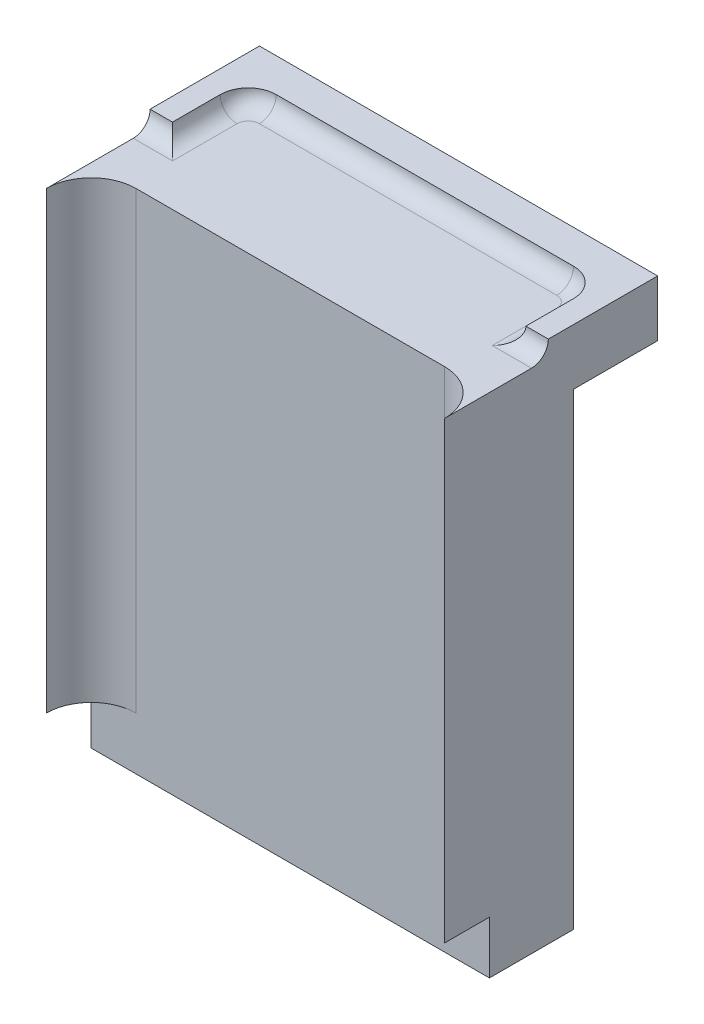
ISO-10303-21;
HEADER;
FILE_DESCRIPTION(('STEP AP214'),'2;1');
FILE_NAME('part.step','',(''),(''),'','','');
FILE_SCHEMA(('AUTOMOTIVE_DESIGN { 1 0 10303 214 1 1 1 1 }'));
ENDSEC;
DATA;
#1=APPLICATION_CONTEXT('core data for automotive mechanical design processes');
#2=APPLICATION_PROTOCOL_DEFINITION('international standard','automotive_design',2000,#1);
#3=PRODUCT_CONTEXT('',#1,'mechanical');
#4=PRODUCT('Part','Part','',(#3));
#5=PRODUCT_RELATED_PRODUCT_CATEGORY('part','',(#4));
#6=PRODUCT_DEFINITION_FORMATION('','',#4);
#7=PRODUCT_DEFINITION_CONTEXT('part definition',#1,'design');
#8=PRODUCT_DEFINITION('design','',#6,#7);
#9=PRODUCT_DEFINITION_SHAPE('','',#8);
#10=(LENGTH_UNIT() NAMED_UNIT(*) SI_UNIT(.MILLI.,.METRE.));
#11=(NAMED_UNIT(*) PLANE_ANGLE_UNIT() SI_UNIT($,.RADIAN.));
#12=(NAMED_UNIT(*) SI_UNIT($,.STERADIAN.) SOLID_ANGLE_UNIT());
#13=UNCERTAINTY_MEASURE_WITH_UNIT(LENGTH_MEASURE(1.E-05),#10,'distance_accuracy_value','');
#14=(GEOMETRIC_REPRESENTATION_CONTEXT(3) GLOBAL_UNCERTAINTY_ASSIGNED_CONTEXT((#13)) GLOBAL_UNIT_ASSIGNED_CONTEXT((#10,
#11,#12)) REPRESENTATION_CONTEXT('',''));
#15=CARTESIAN_POINT('',(0.,0.,0.));
#16=DIRECTION('',(0.,0.,1.));
#17=DIRECTION('',(1.,0.,0.));
#18=AXIS2_PLACEMENT_3D('',#15,#16,#17);
#19=CARTESIAN_POINT('',(-7.1,13.,-0.800000000000005));
#20=DIRECTION('',(-1.,0.,0.));
#21=DIRECTION('',(0.,0.,1.));
#22=AXIS2_PLACEMENT_3D('',#19,#20,#21);
#23=PLANE('',#22);
#24=DIRECTION('',(0.,-1.,0.));
#25=VECTOR('',#24,1.);
#26=CARTESIAN_POINT('',(-7.1,25.7,-5.95));
#27=LINE('',#26,#25);
#28=CARTESIAN_POINT('',(-7.1,4.6,-5.95));
#29=VERTEX_POINT('',#28);
#30=CARTESIAN_POINT('',(-7.1,3.66,-5.95));
#31=VERTEX_POINT('',#30);
#32=EDGE_CURVE('E283',#29,#31,#27,.T.);
#33=ORIENTED_EDGE('',*,*,#32,.F.);
#34=DIRECTION('',(0.,0.,-1.));
#35=VECTOR('',#34,1.);
#36=CARTESIAN_POINT('',(-7.1,4.6,0.));
#37=LINE('',#36,#35);
#38=CARTESIAN_POINT('',(-7.1,4.60000000000001,-5.14999999999999));
#39=VERTEX_POINT('',#38);
#40=EDGE_CURVE('E278',#39,#29,#37,.T.);
#41=ORIENTED_EDGE('',*,*,#40,.F.);
#42=DIRECTION('',(0.,-1.,0.));
#43=VECTOR('',#42,1.);
#44=CARTESIAN_POINT('',(-7.1,25.7,-5.14999999999999));
#45=LINE('',#44,#43);
#46=CARTESIAN_POINT('',(-7.1,12.7,-5.14999999999999));
#47=VERTEX_POINT('',#46);
#48=EDGE_CURVE('E265',#47,#39,#45,.T.);
#49=ORIENTED_EDGE('',*,*,#48,.F.);
#50=DIRECTION('',(0.,0.,1.));
#51=VECTOR('',#50,1.);
#52=CARTESIAN_POINT('',(-7.1,12.7,-0.8));
#53=LINE('',#52,#51);
#54=CARTESIAN_POINT('',(-7.1,12.7,-6.7));
#55=VERTEX_POINT('',#54);
#56=EDGE_CURVE('E280',#55,#47,#53,.T.);
#57=ORIENTED_EDGE('',*,*,#56,.F.);
#58=CARTESIAN_POINT('',(-7.1,13.,-6.7));
#59=DIRECTION('',(-1.,0.,0.));
#60=DIRECTION('',(0.,0.,1.));
#61=AXIS2_PLACEMENT_3D('',#58,#59,#60);
#62=CIRCLE('',#61,0.3);
#63=CARTESIAN_POINT('',(-7.1,13.,-7.));
#64=VERTEX_POINT('',#63);
#65=EDGE_CURVE('E224',#55,#64,#62,.F.);
#66=ORIENTED_EDGE('',*,*,#65,.T.);
#67=DIRECTION('',(0.,0.,1.));
#68=VECTOR('',#67,1.);
#69=CARTESIAN_POINT('',(-7.1,13.,0.));
#70=LINE('',#69,#68);
#71=CARTESIAN_POINT('',(-7.1,13.,-8.95));
#72=VERTEX_POINT('',#71);
#73=EDGE_CURVE('E221',#72,#64,#70,.T.);
#74=ORIENTED_EDGE('',*,*,#73,.F.);
#75=DIRECTION('',(0.,-1.,0.));
#76=VECTOR('',#75,1.);
#77=CARTESIAN_POINT('',(-7.1,13.,-8.95));
#78=LINE('',#77,#76);
#79=CARTESIAN_POINT('',(-7.1,12.,-8.95));
#80=VERTEX_POINT('',#79);
#81=EDGE_CURVE('E296',#72,#80,#78,.T.);
#82=ORIENTED_EDGE('',*,*,#81,.T.);
#83=DIRECTION('',(0.,0.,1.));
#84=VECTOR('',#83,1.);
#85=CARTESIAN_POINT('',(-7.1,12.,0.));
#86=LINE('',#85,#84);
#87=CARTESIAN_POINT('',(-7.1,12.,-7.45));
#88=VERTEX_POINT('',#87);
#89=EDGE_CURVE('E187',#80,#88,#86,.T.);
#90=ORIENTED_EDGE('',*,*,#89,.T.);
#91=DIRECTION('',(0.,1.,0.));
#92=VECTOR('',#91,1.);
#93=CARTESIAN_POINT('',(-7.1,38.1674889490421,-7.45));
#94=LINE('',#93,#92);
#95=CARTESIAN_POINT('',(-7.1,3.66,-7.45));
#96=VERTEX_POINT('',#95);
#97=EDGE_CURVE('E275',#96,#88,#94,.T.);
#98=ORIENTED_EDGE('',*,*,#97,.F.);
#99=DIRECTION('',(0.,0.,1.));
#100=VECTOR('',#99,1.);
#101=CARTESIAN_POINT('',(-7.1,3.66,0.));
#102=LINE('',#101,#100);
#103=EDGE_CURVE('E214',#96,#31,#102,.T.);
#104=ORIENTED_EDGE('',*,*,#103,.T.);
#105=EDGE_LOOP('',(#33,#41,#49,#57,#66,#74,#82,#90,#98,#104));
#106=FACE_BOUND('',#105,.T.);
#107=ADVANCED_FACE('F41',(#106),#23,.T.);
#108=CARTESIAN_POINT('',(0.,13.,-0.800000000000005));
#109=DIRECTION('',(-1.,0.,0.));
#110=DIRECTION('',(0.,0.,1.));
#111=AXIS2_PLACEMENT_3D('',#108,#109,#110);
#112=PLANE('',#111);
#113=DIRECTION('',(0.,0.,-1.));
#114=VECTOR('',#113,1.);
#115=CARTESIAN_POINT('',(0.,4.6,0.));
#116=LINE('',#115,#114);
#117=CARTESIAN_POINT('',(0.,4.60000000000001,-5.15));
#118=VERTEX_POINT('',#117);
#119=CARTESIAN_POINT('',(0.,4.6,-5.95));
#120=VERTEX_POINT('',#119);
#121=EDGE_CURVE('E182',#118,#120,#116,.T.);
#122=ORIENTED_EDGE('',*,*,#121,.T.);
#123=DIRECTION('',(0.,-1.,0.));
#124=VECTOR('',#123,1.);
#125=CARTESIAN_POINT('',(0.,25.7,-5.95));
#126=LINE('',#125,#124);
#127=CARTESIAN_POINT('',(0.,3.66,-5.95));
#128=VERTEX_POINT('',#127);
#129=EDGE_CURVE('E181',#120,#128,#126,.T.);
#130=ORIENTED_EDGE('',*,*,#129,.T.);
#131=DIRECTION('',(0.,0.,1.));
#132=VECTOR('',#131,1.);
#133=CARTESIAN_POINT('',(0.,3.66,0.));
#134=LINE('',#133,#132);
#135=CARTESIAN_POINT('',(0.,3.66,-7.45));
#136=VERTEX_POINT('',#135);
#137=EDGE_CURVE('E211',#136,#128,#134,.T.);
#138=ORIENTED_EDGE('',*,*,#137,.F.);
#139=DIRECTION('',(0.,1.,0.));
#140=VECTOR('',#139,1.);
#141=CARTESIAN_POINT('',(0.,38.1674889490421,-7.45));
#142=LINE('',#141,#140);
#143=CARTESIAN_POINT('',(0.,12.,-7.45));
#144=VERTEX_POINT('',#143);
#145=EDGE_CURVE('E190',#136,#144,#142,.T.);
#146=ORIENTED_EDGE('',*,*,#145,.T.);
#147=DIRECTION('',(0.,0.,1.));
#148=VECTOR('',#147,1.);
#149=CARTESIAN_POINT('',(0.,12.,0.));
#150=LINE('',#149,#148);
#151=CARTESIAN_POINT('',(0.,12.,-8.95));
#152=VERTEX_POINT('',#151);
#153=EDGE_CURVE('E234',#152,#144,#150,.T.);
#154=ORIENTED_EDGE('',*,*,#153,.F.);
#155=DIRECTION('',(0.,-1.,0.));
#156=VECTOR('',#155,1.);
#157=CARTESIAN_POINT('',(0.,13.,-8.95));
#158=LINE('',#157,#156);
#159=CARTESIAN_POINT('',(0.,13.,-8.95));
#160=VERTEX_POINT('',#159);
#161=EDGE_CURVE('E285',#160,#152,#158,.T.);
#162=ORIENTED_EDGE('',*,*,#161,.F.);
#163=DIRECTION('',(0.,0.,1.));
#164=VECTOR('',#163,1.);
#165=CARTESIAN_POINT('',(0.,13.,0.));
#166=LINE('',#165,#164);
#167=CARTESIAN_POINT('',(0.,13.,-7.));
#168=VERTEX_POINT('',#167);
#169=EDGE_CURVE('E293',#160,#168,#166,.T.);
#170=ORIENTED_EDGE('',*,*,#169,.T.);
#171=CARTESIAN_POINT('',(0.,13.,-6.7));
#172=DIRECTION('',(-1.,0.,0.));
#173=DIRECTION('',(0.,0.,1.));
#174=AXIS2_PLACEMENT_3D('',#171,#172,#173);
#175=CIRCLE('',#174,0.3);
#176=CARTESIAN_POINT('',(0.,12.7,-6.7));
#177=VERTEX_POINT('',#176);
#178=EDGE_CURVE('E180',#177,#168,#175,.F.);
#179=ORIENTED_EDGE('',*,*,#178,.F.);
#180=DIRECTION('',(0.,0.,1.));
#181=VECTOR('',#180,1.);
#182=CARTESIAN_POINT('',(0.,12.7,-0.8));
#183=LINE('',#182,#181);
#184=CARTESIAN_POINT('',(0.,12.7,-5.15));
#185=VERTEX_POINT('',#184);
#186=EDGE_CURVE('E170',#177,#185,#183,.T.);
#187=ORIENTED_EDGE('',*,*,#186,.T.);
#188=DIRECTION('',(0.,-1.,0.));
#189=VECTOR('',#188,1.);
#190=CARTESIAN_POINT('',(0.,25.7,-5.15));
#191=LINE('',#190,#189);
#192=EDGE_CURVE('E178',#185,#118,#191,.T.);
#193=ORIENTED_EDGE('',*,*,#192,.T.);
#194=EDGE_LOOP('',(#122,#130,#138,#146,#154,#162,#170,#179,#187,#193));
#195=FACE_BOUND('',#194,.T.);
#196=ADVANCED_FACE('F177',(#195),#112,.F.);
#197=CARTESIAN_POINT('',(0.,3.66,0.));
#198=DIRECTION('',(0.,1.,0.));
#199=DIRECTION('',(0.,0.,1.));
#200=AXIS2_PLACEMENT_3D('',#197,#198,#199);
#201=PLANE('',#200);
#202=ORIENTED_EDGE('',*,*,#103,.F.);
#203=DIRECTION('',(1.,0.,0.));
#204=VECTOR('',#203,1.);
#205=CARTESIAN_POINT('',(-8.54999999999765,3.66,-7.45));
#206=LINE('',#205,#204);
#207=EDGE_CURVE('E49',#96,#136,#206,.T.);
#208=ORIENTED_EDGE('',*,*,#207,.T.);
#209=ORIENTED_EDGE('',*,*,#137,.T.);
#210=DIRECTION('',(-1.,0.,0.));
#211=VECTOR('',#210,1.);
#212=CARTESIAN_POINT('',(-0.800000000000006,3.66,-5.95));
#213=LINE('',#212,#211);
#214=EDGE_CURVE('E199',#128,#31,#213,.T.);
#215=ORIENTED_EDGE('',*,*,#214,.T.);
#216=EDGE_LOOP('',(#202,#208,#209,#215));
#217=FACE_BOUND('',#216,.T.);
#218=ADVANCED_FACE('F210',(#217),#201,.F.);
#219=CARTESIAN_POINT('',(-8.54999999999765,38.1674889490421,-7.45));
#220=DIRECTION('',(0.,0.,-1.));
#221=DIRECTION('',(-1.,0.,0.));
#222=AXIS2_PLACEMENT_3D('',#219,#220,#221);
#223=PLANE('',#222);
#224=ORIENTED_EDGE('',*,*,#207,.F.);
#225=ORIENTED_EDGE('',*,*,#97,.T.);
#226=DIRECTION('',(1.,0.,0.));
#227=VECTOR('',#226,1.);
#228=CARTESIAN_POINT('',(-8.54999999999765,12.,-7.45));
#229=LINE('',#228,#227);
#230=EDGE_CURVE('E202',#88,#144,#229,.T.);
#231=ORIENTED_EDGE('',*,*,#230,.T.);
#232=ORIENTED_EDGE('',*,*,#145,.F.);
#233=EDGE_LOOP('',(#224,#225,#231,#232));
#234=FACE_BOUND('',#233,.T.);
#235=ADVANCED_FACE('F223',(#234),#223,.T.);
#236=CARTESIAN_POINT('',(0.,12.,0.));
#237=DIRECTION('',(0.,1.,0.));
#238=DIRECTION('',(0.,0.,1.));
#239=AXIS2_PLACEMENT_3D('',#236,#237,#238);
#240=PLANE('',#239);
#241=ORIENTED_EDGE('',*,*,#89,.F.);
#242=DIRECTION('',(1.,0.,0.));
#243=VECTOR('',#242,1.);
#244=CARTESIAN_POINT('',(-9.04999999999765,12.,-8.95));
#245=LINE('',#244,#243);
#246=EDGE_CURVE('E11',#80,#152,#245,.T.);
#247=ORIENTED_EDGE('',*,*,#246,.T.);
#248=ORIENTED_EDGE('',*,*,#153,.T.);
#249=ORIENTED_EDGE('',*,*,#230,.F.);
#250=EDGE_LOOP('',(#241,#247,#248,#249));
#251=FACE_BOUND('',#250,.T.);
#252=ADVANCED_FACE('F312',(#251),#240,.F.);
#253=CARTESIAN_POINT('',(-6.2,13.,-7.85));
#254=DIRECTION('',(0.,1.,0.));
#255=DIRECTION('',(0.,0.,1.));
#256=AXIS2_PLACEMENT_3D('',#253,#254,#255);
#257=DEGENERATE_TOROIDAL_SURFACE('',#256,0.2,0.3,.T.);
#258=CARTESIAN_POINT('',(-6.2,13.,-8.05));
#259=DIRECTION('',(-1.,0.,0.));
#260=DIRECTION('',(0.,0.,1.));
#261=AXIS2_PLACEMENT_3D('',#258,#259,#260);
#262=CIRCLE('',#261,0.3);
#263=CARTESIAN_POINT('',(-6.2,13.,-8.35));
#264=VERTEX_POINT('',#263);
#265=CARTESIAN_POINT('',(-6.2,12.7,-8.05));
#266=VERTEX_POINT('',#265);
#267=EDGE_CURVE('E339',#264,#266,#262,.T.);
#268=ORIENTED_EDGE('',*,*,#267,.F.);
#269=CARTESIAN_POINT('',(-6.2,13.,-7.85));
#270=DIRECTION('',(0.,1.,0.));
#271=DIRECTION('',(0.,0.,1.));
#272=AXIS2_PLACEMENT_3D('',#269,#270,#271);
#273=CIRCLE('',#272,0.5);
#274=CARTESIAN_POINT('',(-6.7,13.,-7.85));
#275=VERTEX_POINT('',#274);
#276=EDGE_CURVE('E237',#264,#275,#273,.T.);
#277=ORIENTED_EDGE('',*,*,#276,.T.);
#278=CARTESIAN_POINT('',(-6.4,13.,-7.85));
#279=DIRECTION('',(0.,0.,1.));
#280=DIRECTION('',(1.,0.,0.));
#281=AXIS2_PLACEMENT_3D('',#278,#279,#280);
#282=CIRCLE('',#281,0.3);
#283=CARTESIAN_POINT('',(-6.4,12.7,-7.85));
#284=VERTEX_POINT('',#283);
#285=EDGE_CURVE('E336',#275,#284,#282,.T.);
#286=ORIENTED_EDGE('',*,*,#285,.T.);
#287=CARTESIAN_POINT('',(-6.2,12.7,-7.85));
#288=DIRECTION('',(0.,1.,0.));
#289=DIRECTION('',(0.,0.,1.));
#290=AXIS2_PLACEMENT_3D('',#287,#288,#289);
#291=CIRCLE('',#290,0.2);
#292=EDGE_CURVE('E257',#284,#266,#291,.F.);
#293=ORIENTED_EDGE('',*,*,#292,.T.);
#294=EDGE_LOOP('',(#268,#277,#286,#293));
#295=FACE_BOUND('',#294,.T.);
#296=ADVANCED_FACE('F364',(#295),#257,.F.);
#297=CARTESIAN_POINT('',(-6.2,13.,-8.05));
#298=DIRECTION('',(1.,0.,0.));
#299=DIRECTION('',(0.,0.,-1.));
#300=AXIS2_PLACEMENT_3D('',#297,#298,#299);
#301=CYLINDRICAL_SURFACE('',#300,0.3);
#302=CARTESIAN_POINT('',(-0.900000000000002,13.,-8.05));
#303=DIRECTION('',(-1.,0.,0.));
#304=DIRECTION('',(0.,0.,1.));
#305=AXIS2_PLACEMENT_3D('',#302,#303,#304);
#306=CIRCLE('',#305,0.3);
#307=CARTESIAN_POINT('',(-0.900000000000004,13.,-8.35));
#308=VERTEX_POINT('',#307);
#309=CARTESIAN_POINT('',(-0.900000000000002,12.7,-8.05));
#310=VERTEX_POINT('',#309);
#311=EDGE_CURVE('E342',#308,#310,#306,.T.);
#312=ORIENTED_EDGE('',*,*,#311,.F.);
#313=DIRECTION('',(-1.,0.,0.));
#314=VECTOR('',#313,1.);
#315=CARTESIAN_POINT('',(-6.2,13.,-8.35));
#316=LINE('',#315,#314);
#317=EDGE_CURVE('E233',#308,#264,#316,.T.);
#318=ORIENTED_EDGE('',*,*,#317,.T.);
#319=ORIENTED_EDGE('',*,*,#267,.T.);
#320=DIRECTION('',(-1.,0.,0.));
#321=VECTOR('',#320,1.);
#322=CARTESIAN_POINT('',(-0.900000000000004,12.7,-8.05));
#323=LINE('',#322,#321);
#324=EDGE_CURVE('E259',#266,#310,#323,.F.);
#325=ORIENTED_EDGE('',*,*,#324,.T.);
#326=EDGE_LOOP('',(#312,#318,#319,#325));
#327=FACE_BOUND('',#326,.T.);
#328=ADVANCED_FACE('F358',(#327),#301,.F.);
#329=CARTESIAN_POINT('',(-0.9,13.,-7.85));
#330=DIRECTION('',(0.,1.,0.));
#331=DIRECTION('',(0.,0.,1.));
#332=AXIS2_PLACEMENT_3D('',#329,#330,#331);
#333=DEGENERATE_TOROIDAL_SURFACE('',#332,0.2,0.3,.T.);
#334=CARTESIAN_POINT('',(-0.7,13.,-7.85));
#335=DIRECTION('',(0.,0.,-1.));
#336=DIRECTION('',(-1.,0.,0.));
#337=AXIS2_PLACEMENT_3D('',#334,#335,#336);
#338=CIRCLE('',#337,0.3);
#339=CARTESIAN_POINT('',(-0.4,13.,-7.85));
#340=VERTEX_POINT('',#339);
#341=CARTESIAN_POINT('',(-0.7,12.7,-7.85));
#342=VERTEX_POINT('',#341);
#343=EDGE_CURVE('E345',#340,#342,#338,.T.);
#344=ORIENTED_EDGE('',*,*,#343,.F.);
#345=CARTESIAN_POINT('',(-0.9,13.,-7.85));
#346=DIRECTION('',(0.,1.,0.));
#347=DIRECTION('',(0.,0.,1.));
#348=AXIS2_PLACEMENT_3D('',#345,#346,#347);
#349=CIRCLE('',#348,0.5);
#350=EDGE_CURVE('E330',#340,#308,#349,.T.);
#351=ORIENTED_EDGE('',*,*,#350,.T.);
#352=ORIENTED_EDGE('',*,*,#311,.T.);
#353=CARTESIAN_POINT('',(-0.9,12.7,-7.85));
#354=DIRECTION('',(0.,1.,0.));
#355=DIRECTION('',(0.,0.,1.));
#356=AXIS2_PLACEMENT_3D('',#353,#354,#355);
#357=CIRCLE('',#356,0.2);
#358=EDGE_CURVE('E245',#310,#342,#357,.F.);
#359=ORIENTED_EDGE('',*,*,#358,.T.);
#360=EDGE_LOOP('',(#344,#351,#352,#359));
#361=FACE_BOUND('',#360,.T.);
#362=ADVANCED_FACE('F356',(#361),#333,.F.);
#363=CARTESIAN_POINT('',(-0.800000000000006,25.7,-5.95));
#364=DIRECTION('',(0.,0.,1.));
#365=DIRECTION('',(1.,0.,0.));
#366=AXIS2_PLACEMENT_3D('',#363,#364,#365);
#367=PLANE('',#366);
#368=DIRECTION('',(1.,0.,0.));
#369=VECTOR('',#368,1.);
#370=CARTESIAN_POINT('',(-8.05,4.6,-5.95));
#371=LINE('',#370,#369);
#372=CARTESIAN_POINT('',(-6.29999999999999,4.60000000000001,-5.95));
#373=VERTEX_POINT('',#372);
#374=EDGE_CURVE('E196',#29,#373,#371,.T.);
#375=ORIENTED_EDGE('',*,*,#374,.F.);
#376=ORIENTED_EDGE('',*,*,#32,.T.);
#377=ORIENTED_EDGE('',*,*,#214,.F.);
#378=ORIENTED_EDGE('',*,*,#129,.F.);
#379=CARTESIAN_POINT('',(-0.800000000000006,4.60000000000001,-5.95));
#380=VERTEX_POINT('',#379);
#381=EDGE_CURVE('E198',#380,#120,#371,.T.);
#382=ORIENTED_EDGE('',*,*,#381,.F.);
#383=DIRECTION('',(0.,-1.,0.));
#384=VECTOR('',#383,1.);
#385=CARTESIAN_POINT('',(-0.800000000000006,25.7,-5.95));
#386=LINE('',#385,#384);
#387=CARTESIAN_POINT('',(-0.800000000000006,12.7,-5.95));
#388=VERTEX_POINT('',#387);
#389=EDGE_CURVE('E261',#388,#380,#386,.T.);
#390=ORIENTED_EDGE('',*,*,#389,.F.);
#391=DIRECTION('',(-1.,0.,0.));
#392=VECTOR('',#391,1.);
#393=CARTESIAN_POINT('',(-0.800000000000006,12.7,-5.95));
#394=LINE('',#393,#392);
#395=CARTESIAN_POINT('',(-6.29999999999999,12.7,-5.95));
#396=VERTEX_POINT('',#395);
#397=EDGE_CURVE('E63',#388,#396,#394,.T.);
#398=ORIENTED_EDGE('',*,*,#397,.T.);
#399=DIRECTION('',(0.,-1.,0.));
#400=VECTOR('',#399,1.);
#401=CARTESIAN_POINT('',(-6.29999999999999,25.7,-5.95));
#402=LINE('',#401,#400);
#403=EDGE_CURVE('E263',#396,#373,#402,.T.);
#404=ORIENTED_EDGE('',*,*,#403,.T.);
#405=EDGE_LOOP('',(#375,#376,#377,#378,#382,#390,#398,#404));
#406=FACE_BOUND('',#405,.T.);
#407=ADVANCED_FACE('F304',(#406),#367,.T.);
#408=CARTESIAN_POINT('',(-6.3,25.7,-5.15));
#409=DIRECTION('',(0.,-1.,0.));
#410=DIRECTION('',(0.,0.,-1.));
#411=AXIS2_PLACEMENT_3D('',#408,#409,#410);
#412=CYLINDRICAL_SURFACE('',#411,0.8);
#413=CARTESIAN_POINT('',(-6.3,4.6,-5.15));
#414=DIRECTION('',(0.,-1.,0.));
#415=DIRECTION('',(0.,0.,-1.));
#416=AXIS2_PLACEMENT_3D('',#413,#414,#415);
#417=CIRCLE('',#416,0.8);
#418=EDGE_CURVE('E172',#39,#373,#417,.T.);
#419=ORIENTED_EDGE('',*,*,#418,.T.);
#420=ORIENTED_EDGE('',*,*,#403,.F.);
#421=CARTESIAN_POINT('',(-6.3,12.7,-5.15));
#422=DIRECTION('',(0.,1.,0.));
#423=DIRECTION('',(0.,0.,1.));
#424=AXIS2_PLACEMENT_3D('',#421,#422,#423);
#425=CIRCLE('',#424,0.8);
#426=EDGE_CURVE('E266',#396,#47,#425,.T.);
#427=ORIENTED_EDGE('',*,*,#426,.T.);
#428=ORIENTED_EDGE('',*,*,#48,.T.);
#429=EDGE_LOOP('',(#419,#420,#427,#428));
#430=FACE_BOUND('',#429,.T.);
#431=ADVANCED_FACE('F408',(#430),#412,.F.);
#432=CARTESIAN_POINT('',(0.,4.6,0.));
#433=DIRECTION('',(0.,-1.,0.));
#434=DIRECTION('',(0.,0.,-1.));
#435=AXIS2_PLACEMENT_3D('',#432,#433,#434);
#436=PLANE('',#435);
#437=ORIENTED_EDGE('',*,*,#418,.F.);
#438=ORIENTED_EDGE('',*,*,#40,.T.);
#439=ORIENTED_EDGE('',*,*,#374,.T.);
#440=EDGE_LOOP('',(#437,#438,#439));
#441=FACE_BOUND('',#440,.T.);
#442=ADVANCED_FACE('F401',(#441),#436,.T.);
#443=CARTESIAN_POINT('',(-0.8,25.7,-5.15));
#444=DIRECTION('',(0.,-1.,0.));
#445=DIRECTION('',(0.,0.,-1.));
#446=AXIS2_PLACEMENT_3D('',#443,#444,#445);
#447=CYLINDRICAL_SURFACE('',#446,0.8);
#448=CARTESIAN_POINT('',(-0.8,4.6,-5.15));
#449=DIRECTION('',(0.,-1.,0.));
#450=DIRECTION('',(0.,0.,-1.));
#451=AXIS2_PLACEMENT_3D('',#448,#449,#450);
#452=CIRCLE('',#451,0.8);
#453=EDGE_CURVE('E185',#380,#118,#452,.T.);
#454=ORIENTED_EDGE('',*,*,#453,.T.);
#455=ORIENTED_EDGE('',*,*,#192,.F.);
#456=CARTESIAN_POINT('',(-0.8,12.7,-5.15));
#457=DIRECTION('',(0.,1.,0.));
#458=DIRECTION('',(0.,0.,1.));
#459=AXIS2_PLACEMENT_3D('',#456,#457,#458);
#460=CIRCLE('',#459,0.8);
#461=EDGE_CURVE('E56',#185,#388,#460,.T.);
#462=ORIENTED_EDGE('',*,*,#461,.T.);
#463=ORIENTED_EDGE('',*,*,#389,.T.);
#464=EDGE_LOOP('',(#454,#455,#462,#463));
#465=FACE_BOUND('',#464,.T.);
#466=ADVANCED_FACE('F184',(#465),#447,.F.);
#467=ORIENTED_EDGE('',*,*,#121,.F.);
#468=ORIENTED_EDGE('',*,*,#453,.F.);
#469=ORIENTED_EDGE('',*,*,#381,.T.);
#470=EDGE_LOOP('',(#467,#468,#469));
#471=FACE_BOUND('',#470,.T.);
#472=ADVANCED_FACE('F300',(#471),#436,.T.);
#473=CARTESIAN_POINT('',(-0.7,13.,-7.));
#474=DIRECTION('',(0.,0.,1.));
#475=DIRECTION('',(1.,0.,0.));
#476=AXIS2_PLACEMENT_3D('',#473,#474,#475);
#477=CYLINDRICAL_SURFACE('',#476,0.3);
#478=CARTESIAN_POINT('',(-0.7,13.,-6.7));
#479=DIRECTION('',(0.707106781186547,0.,0.707106781186547));
#480=DIRECTION('',(-0.707106781186547,0.,0.707106781186547));
#481=AXIS2_PLACEMENT_3D('',#478,#479,#480);
#482=ELLIPSE('',#481,0.424264068711928,0.3);
#483=CARTESIAN_POINT('',(-0.4,13.,-7.));
#484=VERTEX_POINT('',#483);
#485=CARTESIAN_POINT('',(-0.7,12.7,-6.7));
#486=VERTEX_POINT('',#485);
#487=EDGE_CURVE('E302',#484,#486,#482,.F.);
#488=ORIENTED_EDGE('',*,*,#487,.F.);
#489=DIRECTION('',(0.,0.,-1.));
#490=VECTOR('',#489,1.);
#491=CARTESIAN_POINT('',(-0.4,13.,-7.85));
#492=LINE('',#491,#490);
#493=EDGE_CURVE('E240',#484,#340,#492,.T.);
#494=ORIENTED_EDGE('',*,*,#493,.T.);
#495=ORIENTED_EDGE('',*,*,#343,.T.);
#496=DIRECTION('',(0.,0.,-1.));
#497=VECTOR('',#496,1.);
#498=CARTESIAN_POINT('',(-0.7,12.7,-7.));
#499=LINE('',#498,#497);
#500=EDGE_CURVE('E241',#342,#486,#499,.F.);
#501=ORIENTED_EDGE('',*,*,#500,.T.);
#502=EDGE_LOOP('',(#488,#494,#495,#501));
#503=FACE_BOUND('',#502,.T.);
#504=ADVANCED_FACE('F351',(#503),#477,.F.);
#505=CARTESIAN_POINT('',(0.,13.,0.));
#506=DIRECTION('',(0.,1.,0.));
#507=DIRECTION('',(0.,0.,1.));
#508=AXIS2_PLACEMENT_3D('',#505,#506,#507);
#509=PLANE('',#508);
#510=DIRECTION('',(-1.,0.,0.));
#511=VECTOR('',#510,1.);
#512=CARTESIAN_POINT('',(-10.0499999999977,13.,-8.95));
#513=LINE('',#512,#511);
#514=EDGE_CURVE('E230',#160,#72,#513,.T.);
#515=ORIENTED_EDGE('',*,*,#514,.T.);
#516=ORIENTED_EDGE('',*,*,#73,.T.);
#517=DIRECTION('',(-1.,0.,0.));
#518=VECTOR('',#517,1.);
#519=CARTESIAN_POINT('',(-7.2,13.,-7.));
#520=LINE('',#519,#518);
#521=CARTESIAN_POINT('',(-6.7,13.,-7.));
#522=VERTEX_POINT('',#521);
#523=EDGE_CURVE('E194',#522,#64,#520,.T.);
#524=ORIENTED_EDGE('',*,*,#523,.F.);
#525=DIRECTION('',(0.,0.,1.));
#526=VECTOR('',#525,1.);
#527=CARTESIAN_POINT('',(-6.7,13.,-7.));
#528=LINE('',#527,#526);
#529=EDGE_CURVE('E326',#275,#522,#528,.T.);
#530=ORIENTED_EDGE('',*,*,#529,.F.);
#531=ORIENTED_EDGE('',*,*,#276,.F.);
#532=ORIENTED_EDGE('',*,*,#317,.F.);
#533=ORIENTED_EDGE('',*,*,#350,.F.);
#534=ORIENTED_EDGE('',*,*,#493,.F.);
#535=DIRECTION('',(-1.,0.,0.));
#536=VECTOR('',#535,1.);
#537=CARTESIAN_POINT('',(-0.4,13.,-7.));
#538=LINE('',#537,#536);
#539=EDGE_CURVE('E235',#168,#484,#538,.T.);
#540=ORIENTED_EDGE('',*,*,#539,.F.);
#541=ORIENTED_EDGE('',*,*,#169,.F.);
#542=EDGE_LOOP('',(#515,#516,#524,#530,#531,#532,#533,#534,#540,#541));
#543=FACE_BOUND('',#542,.T.);
#544=ADVANCED_FACE('F43',(#543),#509,.T.);
#545=CARTESIAN_POINT('',(-6.4,13.,-7.));
#546=DIRECTION('',(0.,0.,-1.));
#547=DIRECTION('',(-1.,0.,0.));
#548=AXIS2_PLACEMENT_3D('',#545,#546,#547);
#549=CYLINDRICAL_SURFACE('',#548,0.3);
#550=ORIENTED_EDGE('',*,*,#285,.F.);
#551=ORIENTED_EDGE('',*,*,#529,.T.);
#552=CARTESIAN_POINT('',(-6.4,13.,-6.7));
#553=DIRECTION('',(0.707106781186547,0.,-0.707106781186547));
#554=DIRECTION('',(0.707106781186547,0.,0.707106781186547));
#555=AXIS2_PLACEMENT_3D('',#552,#553,#554);
#556=ELLIPSE('',#555,0.424264068711928,0.3);
#557=CARTESIAN_POINT('',(-6.4,12.7,-6.7));
#558=VERTEX_POINT('',#557);
#559=EDGE_CURVE('E203',#522,#558,#556,.F.);
#560=ORIENTED_EDGE('',*,*,#559,.T.);
#561=DIRECTION('',(0.,0.,1.));
#562=VECTOR('',#561,1.);
#563=CARTESIAN_POINT('',(-6.4,12.7,-7.85));
#564=LINE('',#563,#562);
#565=EDGE_CURVE('E251',#558,#284,#564,.F.);
#566=ORIENTED_EDGE('',*,*,#565,.T.);
#567=EDGE_LOOP('',(#550,#551,#560,#566));
#568=FACE_BOUND('',#567,.T.);
#569=ADVANCED_FACE('F365',(#568),#549,.F.);
#570=CARTESIAN_POINT('',(0.100000000000002,12.7,-0.8));
#571=DIRECTION('',(0.,1.,0.));
#572=DIRECTION('',(0.,0.,1.));
#573=AXIS2_PLACEMENT_3D('',#570,#571,#572);
#574=PLANE('',#573);
#575=DIRECTION('',(-1.,0.,0.));
#576=VECTOR('',#575,1.);
#577=CARTESIAN_POINT('',(-6.7,12.7,-6.7));
#578=LINE('',#577,#576);
#579=EDGE_CURVE('E239',#55,#558,#578,.F.);
#580=ORIENTED_EDGE('',*,*,#579,.F.);
#581=ORIENTED_EDGE('',*,*,#56,.T.);
#582=ORIENTED_EDGE('',*,*,#426,.F.);
#583=ORIENTED_EDGE('',*,*,#397,.F.);
#584=ORIENTED_EDGE('',*,*,#461,.F.);
#585=ORIENTED_EDGE('',*,*,#186,.F.);
#586=DIRECTION('',(-1.,0.,0.));
#587=VECTOR('',#586,1.);
#588=CARTESIAN_POINT('',(0.0999999999999973,12.7,-6.7));
#589=LINE('',#588,#587);
#590=EDGE_CURVE('E238',#486,#177,#589,.F.);
#591=ORIENTED_EDGE('',*,*,#590,.F.);
#592=ORIENTED_EDGE('',*,*,#500,.F.);
#593=ORIENTED_EDGE('',*,*,#358,.F.);
#594=ORIENTED_EDGE('',*,*,#324,.F.);
#595=ORIENTED_EDGE('',*,*,#292,.F.);
#596=ORIENTED_EDGE('',*,*,#565,.F.);
#597=EDGE_LOOP('',(#580,#581,#582,#583,#584,#585,#591,#592,#593,#594,#595,#596));
#598=FACE_BOUND('',#597,.T.);
#599=ADVANCED_FACE('F168',(#598),#574,.T.);
#600=CARTESIAN_POINT('',(-7.2,13.,-6.7));
#601=DIRECTION('',(1.,0.,0.));
#602=DIRECTION('',(0.,0.,-1.));
#603=AXIS2_PLACEMENT_3D('',#600,#601,#602);
#604=CYLINDRICAL_SURFACE('',#603,0.3);
#605=ORIENTED_EDGE('',*,*,#65,.F.);
#606=ORIENTED_EDGE('',*,*,#579,.T.);
#607=ORIENTED_EDGE('',*,*,#559,.F.);
#608=ORIENTED_EDGE('',*,*,#523,.T.);
#609=EDGE_LOOP('',(#605,#606,#607,#608));
#610=FACE_BOUND('',#609,.T.);
#611=ADVANCED_FACE('F321',(#610),#604,.F.);
#612=CARTESIAN_POINT('',(-0.4,13.,-6.7));
#613=DIRECTION('',(1.,0.,0.));
#614=DIRECTION('',(0.,0.,-1.));
#615=AXIS2_PLACEMENT_3D('',#612,#613,#614);
#616=CYLINDRICAL_SURFACE('',#615,0.3);
#617=ORIENTED_EDGE('',*,*,#590,.T.);
#618=ORIENTED_EDGE('',*,*,#178,.T.);
#619=ORIENTED_EDGE('',*,*,#539,.T.);
#620=ORIENTED_EDGE('',*,*,#487,.T.);
#621=EDGE_LOOP('',(#617,#618,#619,#620));
#622=FACE_BOUND('',#621,.T.);
#623=ADVANCED_FACE('F349',(#622),#616,.F.);
#624=CARTESIAN_POINT('',(-10.0499999999977,13.,-8.95));
#625=DIRECTION('',(0.,0.,1.));
#626=DIRECTION('',(1.,0.,0.));
#627=AXIS2_PLACEMENT_3D('',#624,#625,#626);
#628=PLANE('',#627);
#629=ORIENTED_EDGE('',*,*,#81,.F.);
#630=ORIENTED_EDGE('',*,*,#514,.F.);
#631=ORIENTED_EDGE('',*,*,#161,.T.);
#632=ORIENTED_EDGE('',*,*,#246,.F.);
#633=EDGE_LOOP('',(#629,#630,#631,#632));
#634=FACE_BOUND('',#633,.T.);
#635=ADVANCED_FACE('F316',(#634),#628,.F.);
#636=CLOSED_SHELL('',(#107,#196,#218,#235,#252,#296,#328,#362,#407,#431,#442,#466,#472,#504,
#544,#569,#599,#611,#623,#635));
#637=MANIFOLD_SOLID_BREP('B2',#636);
#638=ADVANCED_BREP_SHAPE_REPRESENTATION('',(#18,#637),#14);
#639=SHAPE_DEFINITION_REPRESENTATION(#9,#638);
ENDSEC;
END-ISO-10303-21;
